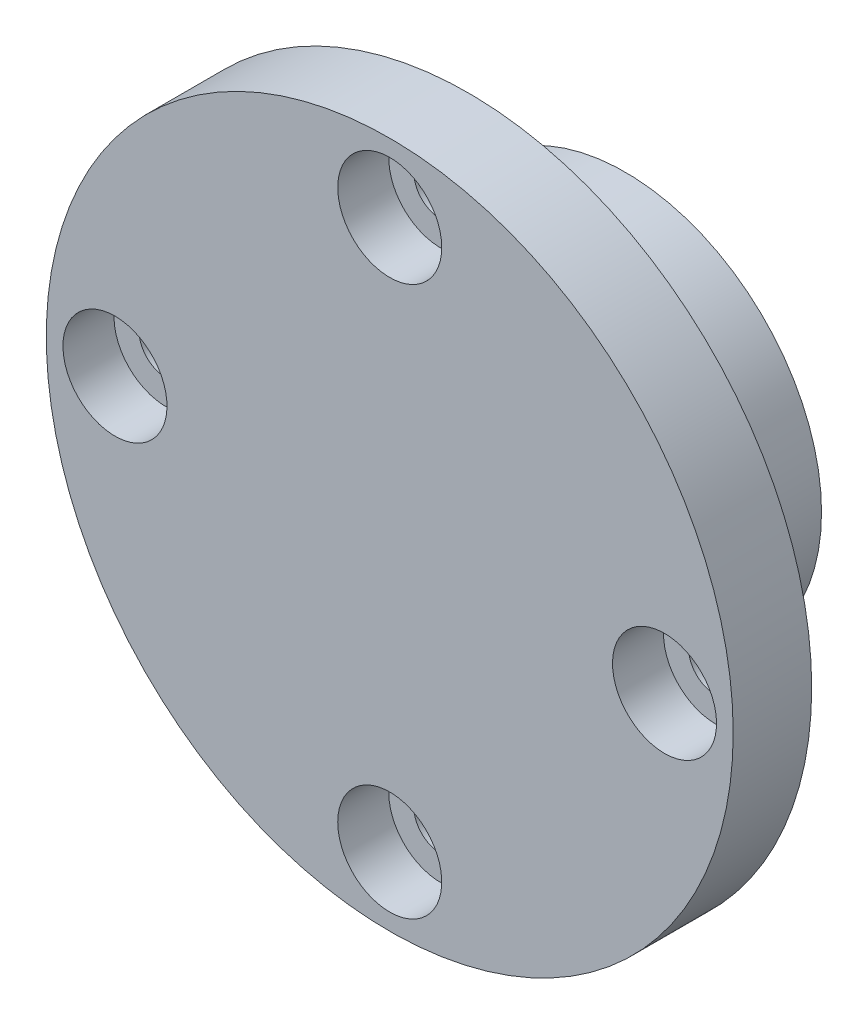
ISO-10303-21;
HEADER;
FILE_DESCRIPTION(('STEP AP214'),'2;1');
FILE_NAME('part.step','',(''),(''),'','','');
FILE_SCHEMA(('AUTOMOTIVE_DESIGN { 1 0 10303 214 1 1 1 1 }'));
ENDSEC;
DATA;
#1=APPLICATION_CONTEXT('core data for automotive mechanical design processes');
#2=APPLICATION_PROTOCOL_DEFINITION('international standard','automotive_design',2000,#1);
#3=PRODUCT_CONTEXT('',#1,'mechanical');
#4=PRODUCT('Part','Part','',(#3));
#5=PRODUCT_RELATED_PRODUCT_CATEGORY('part','',(#4));
#6=PRODUCT_DEFINITION_FORMATION('','',#4);
#7=PRODUCT_DEFINITION_CONTEXT('part definition',#1,'design');
#8=PRODUCT_DEFINITION('design','',#6,#7);
#9=PRODUCT_DEFINITION_SHAPE('','',#8);
#10=(LENGTH_UNIT() NAMED_UNIT(*) SI_UNIT(.MILLI.,.METRE.));
#11=(NAMED_UNIT(*) PLANE_ANGLE_UNIT() SI_UNIT($,.RADIAN.));
#12=(NAMED_UNIT(*) SI_UNIT($,.STERADIAN.) SOLID_ANGLE_UNIT());
#13=UNCERTAINTY_MEASURE_WITH_UNIT(LENGTH_MEASURE(1.E-05),#10,'distance_accuracy_value','');
#14=(GEOMETRIC_REPRESENTATION_CONTEXT(3) GLOBAL_UNCERTAINTY_ASSIGNED_CONTEXT((#13)) GLOBAL_UNIT_ASSIGNED_CONTEXT((#10,
#11,#12)) REPRESENTATION_CONTEXT('',''));
#15=CARTESIAN_POINT('',(0.,0.,0.));
#16=DIRECTION('',(0.,0.,1.));
#17=DIRECTION('',(1.,0.,0.));
#18=AXIS2_PLACEMENT_3D('',#15,#16,#17);
#19=CARTESIAN_POINT('',(14.,1.46642216231412E-13,12.001));
#20=DIRECTION('',(0.,0.,-1.));
#21=DIRECTION('',(-1.,0.,0.));
#22=AXIS2_PLACEMENT_3D('',#19,#20,#21);
#23=CYLINDRICAL_SURFACE('',#22,1.375);
#24=CARTESIAN_POINT('',(14.,1.46642216231412E-13,8.));
#25=DIRECTION('',(0.,0.,-1.));
#26=DIRECTION('',(0.,1.,0.));
#27=AXIS2_PLACEMENT_3D('',#24,#25,#26);
#28=CIRCLE('',#27,1.375);
#29=CARTESIAN_POINT('',(14.,1.37500000000015,8.));
#30=VERTEX_POINT('',#29);
#31=EDGE_CURVE('E146',#30,#30,#28,.T.);
#32=ORIENTED_EDGE('',*,*,#31,.T.);
#33=EDGE_LOOP('',(#32));
#34=FACE_BOUND('',#33,.T.);
#35=CARTESIAN_POINT('',(14.,1.46642216231412E-13,9.4));
#36=DIRECTION('',(0.,0.,1.));
#37=DIRECTION('',(1.,0.,0.));
#38=AXIS2_PLACEMENT_3D('',#35,#36,#37);
#39=CIRCLE('',#38,1.375);
#40=CARTESIAN_POINT('',(15.375,1.46642216231412E-13,9.4));
#41=VERTEX_POINT('',#40);
#42=EDGE_CURVE('E43',#41,#41,#39,.F.);
#43=ORIENTED_EDGE('',*,*,#42,.F.);
#44=EDGE_LOOP('',(#43));
#45=FACE_BOUND('',#44,.T.);
#46=ADVANCED_FACE('F39',(#34,#45),#23,.F.);
#47=CARTESIAN_POINT('',(0.,-14.,12.001));
#48=DIRECTION('',(0.,0.,-1.));
#49=DIRECTION('',(-1.,0.,0.));
#50=AXIS2_PLACEMENT_3D('',#47,#48,#49);
#51=CYLINDRICAL_SURFACE('',#50,1.375);
#52=CARTESIAN_POINT('',(0.,-14.,8.));
#53=DIRECTION('',(0.,0.,-1.));
#54=DIRECTION('',(1.,0.,0.));
#55=AXIS2_PLACEMENT_3D('',#52,#53,#54);
#56=CIRCLE('',#55,1.375);
#57=CARTESIAN_POINT('',(1.375,-14.,8.));
#58=VERTEX_POINT('',#57);
#59=EDGE_CURVE('E177',#58,#58,#56,.T.);
#60=ORIENTED_EDGE('',*,*,#59,.T.);
#61=EDGE_LOOP('',(#60));
#62=FACE_BOUND('',#61,.T.);
#63=CARTESIAN_POINT('',(0.,-14.,9.4));
#64=DIRECTION('',(0.,0.,1.));
#65=DIRECTION('',(1.,0.,0.));
#66=AXIS2_PLACEMENT_3D('',#63,#64,#65);
#67=CIRCLE('',#66,1.375);
#68=CARTESIAN_POINT('',(1.375,-14.,9.4));
#69=VERTEX_POINT('',#68);
#70=EDGE_CURVE('E151',#69,#69,#67,.F.);
#71=ORIENTED_EDGE('',*,*,#70,.F.);
#72=EDGE_LOOP('',(#71));
#73=FACE_BOUND('',#72,.T.);
#74=ADVANCED_FACE('F243',(#62,#73),#51,.F.);
#75=CARTESIAN_POINT('',(-14.,0.,12.001));
#76=DIRECTION('',(0.,0.,-1.));
#77=DIRECTION('',(-1.,0.,0.));
#78=AXIS2_PLACEMENT_3D('',#75,#76,#77);
#79=CYLINDRICAL_SURFACE('',#78,1.375);
#80=CARTESIAN_POINT('',(-14.,0.,8.));
#81=DIRECTION('',(0.,0.,-1.));
#82=DIRECTION('',(0.,-1.,0.));
#83=AXIS2_PLACEMENT_3D('',#80,#81,#82);
#84=CIRCLE('',#83,1.375);
#85=CARTESIAN_POINT('',(-14.,-1.37500000000005,8.));
#86=VERTEX_POINT('',#85);
#87=EDGE_CURVE('E172',#86,#86,#84,.T.);
#88=ORIENTED_EDGE('',*,*,#87,.T.);
#89=EDGE_LOOP('',(#88));
#90=FACE_BOUND('',#89,.T.);
#91=CARTESIAN_POINT('',(-14.,0.,9.4));
#92=DIRECTION('',(0.,0.,1.));
#93=DIRECTION('',(1.,0.,0.));
#94=AXIS2_PLACEMENT_3D('',#91,#92,#93);
#95=CIRCLE('',#94,1.375);
#96=CARTESIAN_POINT('',(-12.625,0.,9.4));
#97=VERTEX_POINT('',#96);
#98=EDGE_CURVE('E148',#97,#97,#95,.F.);
#99=ORIENTED_EDGE('',*,*,#98,.F.);
#100=EDGE_LOOP('',(#99));
#101=FACE_BOUND('',#100,.T.);
#102=ADVANCED_FACE('F249',(#90,#101),#79,.F.);
#103=CARTESIAN_POINT('',(0.,14.,12.001));
#104=DIRECTION('',(0.,0.,-1.));
#105=DIRECTION('',(-1.,0.,0.));
#106=AXIS2_PLACEMENT_3D('',#103,#104,#105);
#107=CYLINDRICAL_SURFACE('',#106,1.375);
#108=CARTESIAN_POINT('',(0.,14.,8.));
#109=DIRECTION('',(0.,0.,-1.));
#110=DIRECTION('',(-1.,0.,0.));
#111=AXIS2_PLACEMENT_3D('',#108,#109,#110);
#112=CIRCLE('',#111,1.375);
#113=CARTESIAN_POINT('',(-1.375,14.,8.));
#114=VERTEX_POINT('',#113);
#115=EDGE_CURVE('E176',#114,#114,#112,.T.);
#116=ORIENTED_EDGE('',*,*,#115,.T.);
#117=EDGE_LOOP('',(#116));
#118=FACE_BOUND('',#117,.T.);
#119=CARTESIAN_POINT('',(0.,14.,9.4));
#120=DIRECTION('',(0.,0.,1.));
#121=DIRECTION('',(1.,0.,0.));
#122=AXIS2_PLACEMENT_3D('',#119,#120,#121);
#123=CIRCLE('',#122,1.375);
#124=CARTESIAN_POINT('',(1.375,14.,9.4));
#125=VERTEX_POINT('',#124);
#126=EDGE_CURVE('E142',#125,#125,#123,.F.);
#127=ORIENTED_EDGE('',*,*,#126,.F.);
#128=EDGE_LOOP('',(#127));
#129=FACE_BOUND('',#128,.T.);
#130=ADVANCED_FACE('F255',(#118,#129),#107,.F.);
#131=CARTESIAN_POINT('',(0.,0.,0.));
#132=DIRECTION('',(0.,0.,1.));
#133=DIRECTION('',(1.,0.,0.));
#134=AXIS2_PLACEMENT_3D('',#131,#132,#133);
#135=PLANE('',#134);
#136=CARTESIAN_POINT('',(0.,0.,0.));
#137=DIRECTION('',(0.,0.,1.));
#138=DIRECTION('',(1.,0.,0.));
#139=AXIS2_PLACEMENT_3D('',#136,#137,#138);
#140=CIRCLE('',#139,10.);
#141=CARTESIAN_POINT('',(10.,0.,0.));
#142=VERTEX_POINT('',#141);
#143=EDGE_CURVE('E49',#142,#142,#140,.T.);
#144=ORIENTED_EDGE('',*,*,#143,.F.);
#145=EDGE_LOOP('',(#144));
#146=FACE_BOUND('',#145,.T.);
#147=DIRECTION('',(0.499999999999995,0.866025403784441,0.));
#148=VECTOR('',#147,1.);
#149=CARTESIAN_POINT('',(3.6661742093542,-6.34999999999996,0.));
#150=LINE('',#149,#148);
#151=CARTESIAN_POINT('',(3.6661742093542,-6.34999999999996,0.));
#152=VERTEX_POINT('',#151);
#153=CARTESIAN_POINT('',(7.33234841870825,0.,0.));
#154=VERTEX_POINT('',#153);
#155=EDGE_CURVE('E57',#152,#154,#150,.T.);
#156=ORIENTED_EDGE('',*,*,#155,.T.);
#157=DIRECTION('',(-0.500000000000001,0.866025403784438,0.));
#158=VECTOR('',#157,1.);
#159=CARTESIAN_POINT('',(7.33234841870825,0.,0.));
#160=LINE('',#159,#158);
#161=CARTESIAN_POINT('',(3.66617420935411,6.35000000000001,0.));
#162=VERTEX_POINT('',#161);
#163=EDGE_CURVE('E118',#154,#162,#160,.T.);
#164=ORIENTED_EDGE('',*,*,#163,.T.);
#165=DIRECTION('',(-1.,0.,0.));
#166=VECTOR('',#165,1.);
#167=CARTESIAN_POINT('',(3.66617420935411,6.35000000000001,0.));
#168=LINE('',#167,#166);
#169=CARTESIAN_POINT('',(-3.66617420935416,6.34999999999999,0.));
#170=VERTEX_POINT('',#169);
#171=EDGE_CURVE('E114',#162,#170,#168,.T.);
#172=ORIENTED_EDGE('',*,*,#171,.T.);
#173=DIRECTION('',(-0.499999999999995,-0.866025403784442,0.));
#174=VECTOR('',#173,1.);
#175=CARTESIAN_POINT('',(-3.66617420935416,6.34999999999999,0.));
#176=LINE('',#175,#174);
#177=CARTESIAN_POINT('',(-7.33234841870825,0.,0.));
#178=VERTEX_POINT('',#177);
#179=EDGE_CURVE('E92',#170,#178,#176,.T.);
#180=ORIENTED_EDGE('',*,*,#179,.T.);
#181=DIRECTION('',(0.500000000000007,-0.866025403784434,0.));
#182=VECTOR('',#181,1.);
#183=CARTESIAN_POINT('',(-7.33234841870825,0.,0.));
#184=LINE('',#183,#182);
#185=CARTESIAN_POINT('',(-3.66617420935407,-6.35000000000004,0.));
#186=VERTEX_POINT('',#185);
#187=EDGE_CURVE('E102',#178,#186,#184,.T.);
#188=ORIENTED_EDGE('',*,*,#187,.T.);
#189=DIRECTION('',(1.,0.,0.));
#190=VECTOR('',#189,1.);
#191=CARTESIAN_POINT('',(-3.66617420935407,-6.35000000000004,0.));
#192=LINE('',#191,#190);
#193=EDGE_CURVE('E109',#186,#152,#192,.T.);
#194=ORIENTED_EDGE('',*,*,#193,.T.);
#195=EDGE_LOOP('',(#156,#164,#172,#180,#188,#194));
#196=FACE_BOUND('',#195,.T.);
#197=ADVANCED_FACE('F111',(#146,#196),#135,.F.);
#198=CARTESIAN_POINT('',(0.,0.,8.));
#199=DIRECTION('',(0.,0.,-1.));
#200=DIRECTION('',(-1.,0.,0.));
#201=AXIS2_PLACEMENT_3D('',#198,#199,#200);
#202=CYLINDRICAL_SURFACE('',#201,10.);
#203=CARTESIAN_POINT('',(0.,0.,8.));
#204=DIRECTION('',(0.,0.,1.));
#205=DIRECTION('',(1.,0.,0.));
#206=AXIS2_PLACEMENT_3D('',#203,#204,#205);
#207=CIRCLE('',#206,10.);
#208=CARTESIAN_POINT('',(10.,0.,8.));
#209=VERTEX_POINT('',#208);
#210=EDGE_CURVE('E11',#209,#209,#207,.T.);
#211=ORIENTED_EDGE('',*,*,#210,.F.);
#212=EDGE_LOOP('',(#211));
#213=FACE_BOUND('',#212,.T.);
#214=ORIENTED_EDGE('',*,*,#143,.T.);
#215=EDGE_LOOP('',(#214));
#216=FACE_BOUND('',#215,.T.);
#217=ADVANCED_FACE('F41',(#213,#216),#202,.T.);
#218=CARTESIAN_POINT('',(3.6661742093542,-6.34999999999996,8.));
#219=DIRECTION('',(-0.866025403784441,0.499999999999995,0.));
#220=DIRECTION('',(-0.499999999999995,-0.866025403784442,0.));
#221=AXIS2_PLACEMENT_3D('',#218,#219,#220);
#222=PLANE('',#221);
#223=ORIENTED_EDGE('',*,*,#155,.F.);
#224=DIRECTION('',(0.,0.,-1.));
#225=VECTOR('',#224,1.);
#226=CARTESIAN_POINT('',(3.6661742093542,-6.34999999999996,8.));
#227=LINE('',#226,#225);
#228=CARTESIAN_POINT('',(3.6661742093542,-6.34999999999996,8.));
#229=VERTEX_POINT('',#228);
#230=EDGE_CURVE('E125',#229,#152,#227,.T.);
#231=ORIENTED_EDGE('',*,*,#230,.F.);
#232=DIRECTION('',(0.499999999999995,0.866025403784441,0.));
#233=VECTOR('',#232,1.);
#234=CARTESIAN_POINT('',(3.6661742093542,-6.34999999999996,8.));
#235=LINE('',#234,#233);
#236=CARTESIAN_POINT('',(7.33234841870825,0.,8.));
#237=VERTEX_POINT('',#236);
#238=EDGE_CURVE('E124',#229,#237,#235,.T.);
#239=ORIENTED_EDGE('',*,*,#238,.T.);
#240=DIRECTION('',(0.,0.,-1.));
#241=VECTOR('',#240,1.);
#242=CARTESIAN_POINT('',(7.33234841870825,0.,8.));
#243=LINE('',#242,#241);
#244=EDGE_CURVE('E136',#237,#154,#243,.T.);
#245=ORIENTED_EDGE('',*,*,#244,.T.);
#246=EDGE_LOOP('',(#223,#231,#239,#245));
#247=FACE_BOUND('',#246,.T.);
#248=ADVANCED_FACE('F219',(#247),#222,.T.);
#249=CARTESIAN_POINT('',(7.33234841870825,0.,8.));
#250=DIRECTION('',(-0.866025403784438,-0.500000000000001,0.));
#251=DIRECTION('',(0.500000000000001,-0.866025403784438,0.));
#252=AXIS2_PLACEMENT_3D('',#249,#250,#251);
#253=PLANE('',#252);
#254=ORIENTED_EDGE('',*,*,#163,.F.);
#255=ORIENTED_EDGE('',*,*,#244,.F.);
#256=DIRECTION('',(-0.500000000000001,0.866025403784438,0.));
#257=VECTOR('',#256,1.);
#258=CARTESIAN_POINT('',(7.33234841870825,0.,8.));
#259=LINE('',#258,#257);
#260=CARTESIAN_POINT('',(3.66617420935411,6.35000000000001,8.));
#261=VERTEX_POINT('',#260);
#262=EDGE_CURVE('E198',#237,#261,#259,.T.);
#263=ORIENTED_EDGE('',*,*,#262,.T.);
#264=DIRECTION('',(0.,0.,-1.));
#265=VECTOR('',#264,1.);
#266=CARTESIAN_POINT('',(3.66617420935411,6.35000000000001,8.));
#267=LINE('',#266,#265);
#268=EDGE_CURVE('E133',#261,#162,#267,.T.);
#269=ORIENTED_EDGE('',*,*,#268,.T.);
#270=EDGE_LOOP('',(#254,#255,#263,#269));
#271=FACE_BOUND('',#270,.T.);
#272=ADVANCED_FACE('F217',(#271),#253,.T.);
#273=CARTESIAN_POINT('',(3.66617420935411,6.35000000000001,8.));
#274=DIRECTION('',(0.,-1.,0.));
#275=DIRECTION('',(1.,0.,0.));
#276=AXIS2_PLACEMENT_3D('',#273,#274,#275);
#277=PLANE('',#276);
#278=ORIENTED_EDGE('',*,*,#171,.F.);
#279=ORIENTED_EDGE('',*,*,#268,.F.);
#280=DIRECTION('',(-1.,0.,0.));
#281=VECTOR('',#280,1.);
#282=CARTESIAN_POINT('',(3.66617420935411,6.35000000000001,8.));
#283=LINE('',#282,#281);
#284=CARTESIAN_POINT('',(-3.66617420935416,6.34999999999999,8.));
#285=VERTEX_POINT('',#284);
#286=EDGE_CURVE('E202',#261,#285,#283,.T.);
#287=ORIENTED_EDGE('',*,*,#286,.T.);
#288=DIRECTION('',(0.,0.,-1.));
#289=VECTOR('',#288,1.);
#290=CARTESIAN_POINT('',(-3.66617420935416,6.34999999999999,8.));
#291=LINE('',#290,#289);
#292=EDGE_CURVE('E98',#285,#170,#291,.T.);
#293=ORIENTED_EDGE('',*,*,#292,.T.);
#294=EDGE_LOOP('',(#278,#279,#287,#293));
#295=FACE_BOUND('',#294,.T.);
#296=ADVANCED_FACE('F233',(#295),#277,.T.);
#297=CARTESIAN_POINT('',(-3.66617420935416,6.34999999999999,8.));
#298=DIRECTION('',(0.866025403784442,-0.499999999999995,0.));
#299=DIRECTION('',(0.499999999999995,0.866025403784442,0.));
#300=AXIS2_PLACEMENT_3D('',#297,#298,#299);
#301=PLANE('',#300);
#302=ORIENTED_EDGE('',*,*,#179,.F.);
#303=ORIENTED_EDGE('',*,*,#292,.F.);
#304=DIRECTION('',(-0.499999999999995,-0.866025403784442,0.));
#305=VECTOR('',#304,1.);
#306=CARTESIAN_POINT('',(-3.66617420935416,6.34999999999999,8.));
#307=LINE('',#306,#305);
#308=CARTESIAN_POINT('',(-7.33234841870825,0.,8.));
#309=VERTEX_POINT('',#308);
#310=EDGE_CURVE('E66',#285,#309,#307,.T.);
#311=ORIENTED_EDGE('',*,*,#310,.T.);
#312=DIRECTION('',(0.,0.,-1.));
#313=VECTOR('',#312,1.);
#314=CARTESIAN_POINT('',(-7.33234841870825,0.,8.));
#315=LINE('',#314,#313);
#316=EDGE_CURVE('E87',#309,#178,#315,.T.);
#317=ORIENTED_EDGE('',*,*,#316,.T.);
#318=EDGE_LOOP('',(#302,#303,#311,#317));
#319=FACE_BOUND('',#318,.T.);
#320=ADVANCED_FACE('F89',(#319),#301,.T.);
#321=CARTESIAN_POINT('',(-7.33234841870825,0.,8.));
#322=DIRECTION('',(0.866025403784435,0.500000000000007,0.));
#323=DIRECTION('',(-0.500000000000007,0.866025403784435,0.));
#324=AXIS2_PLACEMENT_3D('',#321,#322,#323);
#325=PLANE('',#324);
#326=ORIENTED_EDGE('',*,*,#187,.F.);
#327=ORIENTED_EDGE('',*,*,#316,.F.);
#328=DIRECTION('',(0.500000000000007,-0.866025403784434,0.));
#329=VECTOR('',#328,1.);
#330=CARTESIAN_POINT('',(-7.33234841870825,0.,8.));
#331=LINE('',#330,#329);
#332=CARTESIAN_POINT('',(-3.66617420935407,-6.35000000000004,8.));
#333=VERTEX_POINT('',#332);
#334=EDGE_CURVE('E207',#309,#333,#331,.T.);
#335=ORIENTED_EDGE('',*,*,#334,.T.);
#336=DIRECTION('',(0.,0.,-1.));
#337=VECTOR('',#336,1.);
#338=CARTESIAN_POINT('',(-3.66617420935407,-6.35000000000004,8.));
#339=LINE('',#338,#337);
#340=EDGE_CURVE('E99',#333,#186,#339,.T.);
#341=ORIENTED_EDGE('',*,*,#340,.T.);
#342=EDGE_LOOP('',(#326,#327,#335,#341));
#343=FACE_BOUND('',#342,.T.);
#344=ADVANCED_FACE('F103',(#343),#325,.T.);
#345=CARTESIAN_POINT('',(-3.66617420935407,-6.35000000000004,8.));
#346=DIRECTION('',(0.,1.,0.));
#347=DIRECTION('',(-1.,0.,0.));
#348=AXIS2_PLACEMENT_3D('',#345,#346,#347);
#349=PLANE('',#348);
#350=ORIENTED_EDGE('',*,*,#193,.F.);
#351=ORIENTED_EDGE('',*,*,#340,.F.);
#352=DIRECTION('',(1.,0.,0.));
#353=VECTOR('',#352,1.);
#354=CARTESIAN_POINT('',(-3.66617420935407,-6.35000000000004,8.));
#355=LINE('',#354,#353);
#356=EDGE_CURVE('E128',#333,#229,#355,.T.);
#357=ORIENTED_EDGE('',*,*,#356,.T.);
#358=ORIENTED_EDGE('',*,*,#230,.T.);
#359=EDGE_LOOP('',(#350,#351,#357,#358));
#360=FACE_BOUND('',#359,.T.);
#361=ADVANCED_FACE('F227',(#360),#349,.T.);
#362=CARTESIAN_POINT('',(0.,0.,8.));
#363=DIRECTION('',(0.,0.,1.));
#364=DIRECTION('',(1.,0.,0.));
#365=AXIS2_PLACEMENT_3D('',#362,#363,#364);
#366=PLANE('',#365);
#367=ORIENTED_EDGE('',*,*,#262,.F.);
#368=ORIENTED_EDGE('',*,*,#238,.F.);
#369=ORIENTED_EDGE('',*,*,#356,.F.);
#370=ORIENTED_EDGE('',*,*,#334,.F.);
#371=ORIENTED_EDGE('',*,*,#310,.F.);
#372=ORIENTED_EDGE('',*,*,#286,.F.);
#373=EDGE_LOOP('',(#367,#368,#369,#370,#371,#372));
#374=FACE_BOUND('',#373,.T.);
#375=ADVANCED_FACE('F224',(#374),#366,.F.);
#376=ORIENTED_EDGE('',*,*,#87,.F.);
#377=EDGE_LOOP('',(#376));
#378=FACE_BOUND('',#377,.T.);
#379=ORIENTED_EDGE('',*,*,#59,.F.);
#380=EDGE_LOOP('',(#379));
#381=FACE_BOUND('',#380,.T.);
#382=ORIENTED_EDGE('',*,*,#31,.F.);
#383=EDGE_LOOP('',(#382));
#384=FACE_BOUND('',#383,.T.);
#385=ORIENTED_EDGE('',*,*,#115,.F.);
#386=EDGE_LOOP('',(#385));
#387=FACE_BOUND('',#386,.T.);
#388=CARTESIAN_POINT('',(0.,0.,8.));
#389=DIRECTION('',(0.,0.,1.));
#390=DIRECTION('',(1.,0.,0.));
#391=AXIS2_PLACEMENT_3D('',#388,#389,#390);
#392=CIRCLE('',#391,17.5);
#393=CARTESIAN_POINT('',(17.5,0.,8.));
#394=VERTEX_POINT('',#393);
#395=EDGE_CURVE('E187',#394,#394,#392,.T.);
#396=ORIENTED_EDGE('',*,*,#395,.F.);
#397=EDGE_LOOP('',(#396));
#398=FACE_BOUND('',#397,.T.);
#399=ORIENTED_EDGE('',*,*,#210,.T.);
#400=EDGE_LOOP('',(#399));
#401=FACE_BOUND('',#400,.T.);
#402=ADVANCED_FACE('F267',(#378,#381,#384,#387,#398,#401),#366,.F.);
#403=CARTESIAN_POINT('',(0.,0.,12.));
#404=DIRECTION('',(0.,0.,-1.));
#405=DIRECTION('',(-1.,0.,0.));
#406=AXIS2_PLACEMENT_3D('',#403,#404,#405);
#407=CYLINDRICAL_SURFACE('',#406,17.5);
#408=CARTESIAN_POINT('',(0.,0.,12.));
#409=DIRECTION('',(0.,0.,1.));
#410=DIRECTION('',(1.,0.,0.));
#411=AXIS2_PLACEMENT_3D('',#408,#409,#410);
#412=CIRCLE('',#411,17.5);
#413=CARTESIAN_POINT('',(17.5,0.,12.));
#414=VERTEX_POINT('',#413);
#415=EDGE_CURVE('E188',#414,#414,#412,.T.);
#416=ORIENTED_EDGE('',*,*,#415,.F.);
#417=EDGE_LOOP('',(#416));
#418=FACE_BOUND('',#417,.T.);
#419=ORIENTED_EDGE('',*,*,#395,.T.);
#420=EDGE_LOOP('',(#419));
#421=FACE_BOUND('',#420,.T.);
#422=ADVANCED_FACE('F263',(#418,#421),#407,.T.);
#423=CARTESIAN_POINT('',(0.,0.,12.));
#424=DIRECTION('',(0.,0.,1.));
#425=DIRECTION('',(1.,0.,0.));
#426=AXIS2_PLACEMENT_3D('',#423,#424,#425);
#427=PLANE('',#426);
#428=CARTESIAN_POINT('',(14.,0.,12.));
#429=DIRECTION('',(0.,0.,1.));
#430=DIRECTION('',(0.,-1.,0.));
#431=AXIS2_PLACEMENT_3D('',#428,#429,#430);
#432=CIRCLE('',#431,2.65);
#433=CARTESIAN_POINT('',(14.,-2.65000000000005,12.));
#434=VERTEX_POINT('',#433);
#435=EDGE_CURVE('E481',#434,#434,#432,.T.);
#436=ORIENTED_EDGE('',*,*,#435,.F.);
#437=EDGE_LOOP('',(#436));
#438=FACE_BOUND('',#437,.T.);
#439=CARTESIAN_POINT('',(0.,-14.,12.));
#440=DIRECTION('',(0.,0.,1.));
#441=DIRECTION('',(-1.,0.,0.));
#442=AXIS2_PLACEMENT_3D('',#439,#440,#441);
#443=CIRCLE('',#442,2.65);
#444=CARTESIAN_POINT('',(-2.65,-14.,12.));
#445=VERTEX_POINT('',#444);
#446=EDGE_CURVE('E489',#445,#445,#443,.T.);
#447=ORIENTED_EDGE('',*,*,#446,.F.);
#448=EDGE_LOOP('',(#447));
#449=FACE_BOUND('',#448,.T.);
#450=CARTESIAN_POINT('',(-14.,1.46642216231412E-13,12.));
#451=DIRECTION('',(0.,0.,1.));
#452=DIRECTION('',(0.,1.,0.));
#453=AXIS2_PLACEMENT_3D('',#450,#451,#452);
#454=CIRCLE('',#453,2.65);
#455=CARTESIAN_POINT('',(-14.,2.65000000000015,12.));
#456=VERTEX_POINT('',#455);
#457=EDGE_CURVE('E498',#456,#456,#454,.T.);
#458=ORIENTED_EDGE('',*,*,#457,.F.);
#459=EDGE_LOOP('',(#458));
#460=FACE_BOUND('',#459,.T.);
#461=CARTESIAN_POINT('',(0.,14.,12.));
#462=DIRECTION('',(0.,0.,1.));
#463=DIRECTION('',(1.,0.,0.));
#464=AXIS2_PLACEMENT_3D('',#461,#462,#463);
#465=CIRCLE('',#464,2.65);
#466=CARTESIAN_POINT('',(2.65,14.,12.));
#467=VERTEX_POINT('',#466);
#468=EDGE_CURVE('E159',#467,#467,#465,.T.);
#469=ORIENTED_EDGE('',*,*,#468,.F.);
#470=EDGE_LOOP('',(#469));
#471=FACE_BOUND('',#470,.T.);
#472=ORIENTED_EDGE('',*,*,#415,.T.);
#473=EDGE_LOOP('',(#472));
#474=FACE_BOUND('',#473,.T.);
#475=ADVANCED_FACE('F259',(#438,#449,#460,#471,#474),#427,.T.);
#476=CARTESIAN_POINT('',(0.,14.,9.4));
#477=DIRECTION('',(0.,0.,1.));
#478=DIRECTION('',(1.,0.,0.));
#479=AXIS2_PLACEMENT_3D('',#476,#477,#478);
#480=PLANE('',#479);
#481=CARTESIAN_POINT('',(0.,14.,9.4));
#482=DIRECTION('',(0.,0.,1.));
#483=DIRECTION('',(1.,0.,0.));
#484=AXIS2_PLACEMENT_3D('',#481,#482,#483);
#485=CIRCLE('',#484,2.65);
#486=CARTESIAN_POINT('',(2.65,14.,9.4));
#487=VERTEX_POINT('',#486);
#488=EDGE_CURVE('E147',#487,#487,#485,.T.);
#489=ORIENTED_EDGE('',*,*,#488,.T.);
#490=EDGE_LOOP('',(#489));
#491=FACE_BOUND('',#490,.T.);
#492=ORIENTED_EDGE('',*,*,#126,.T.);
#493=EDGE_LOOP('',(#492));
#494=FACE_BOUND('',#493,.T.);
#495=ADVANCED_FACE('F262',(#491,#494),#480,.T.);
#496=CARTESIAN_POINT('',(0.,14.,9.4));
#497=DIRECTION('',(0.,0.,1.));
#498=DIRECTION('',(1.,0.,0.));
#499=AXIS2_PLACEMENT_3D('',#496,#497,#498);
#500=CYLINDRICAL_SURFACE('',#499,2.65);
#501=ORIENTED_EDGE('',*,*,#488,.F.);
#502=EDGE_LOOP('',(#501));
#503=FACE_BOUND('',#502,.T.);
#504=ORIENTED_EDGE('',*,*,#468,.T.);
#505=EDGE_LOOP('',(#504));
#506=FACE_BOUND('',#505,.T.);
#507=ADVANCED_FACE('F309',(#503,#506),#500,.F.);
#508=CARTESIAN_POINT('',(-14.,1.46642216231412E-13,9.4));
#509=DIRECTION('',(0.,0.,1.));
#510=DIRECTION('',(0.,1.,0.));
#511=AXIS2_PLACEMENT_3D('',#508,#509,#510);
#512=PLANE('',#511);
#513=CARTESIAN_POINT('',(-14.,1.46642216231412E-13,9.4));
#514=DIRECTION('',(0.,0.,1.));
#515=DIRECTION('',(0.,1.,0.));
#516=AXIS2_PLACEMENT_3D('',#513,#514,#515);
#517=CIRCLE('',#516,2.65);
#518=CARTESIAN_POINT('',(-14.,2.65000000000015,9.4));
#519=VERTEX_POINT('',#518);
#520=EDGE_CURVE('E495',#519,#519,#517,.T.);
#521=ORIENTED_EDGE('',*,*,#520,.T.);
#522=EDGE_LOOP('',(#521));
#523=FACE_BOUND('',#522,.T.);
#524=ORIENTED_EDGE('',*,*,#98,.T.);
#525=EDGE_LOOP('',(#524));
#526=FACE_BOUND('',#525,.T.);
#527=ADVANCED_FACE('F317',(#523,#526),#512,.T.);
#528=CARTESIAN_POINT('',(-14.,1.46642216231412E-13,9.4));
#529=DIRECTION('',(0.,0.,1.));
#530=DIRECTION('',(1.,0.,0.));
#531=AXIS2_PLACEMENT_3D('',#528,#529,#530);
#532=CYLINDRICAL_SURFACE('',#531,2.65);
#533=ORIENTED_EDGE('',*,*,#520,.F.);
#534=EDGE_LOOP('',(#533));
#535=FACE_BOUND('',#534,.T.);
#536=ORIENTED_EDGE('',*,*,#457,.T.);
#537=EDGE_LOOP('',(#536));
#538=FACE_BOUND('',#537,.T.);
#539=ADVANCED_FACE('F324',(#535,#538),#532,.F.);
#540=CARTESIAN_POINT('',(0.,-14.,9.4));
#541=DIRECTION('',(0.,0.,1.));
#542=DIRECTION('',(-1.,0.,0.));
#543=AXIS2_PLACEMENT_3D('',#540,#541,#542);
#544=PLANE('',#543);
#545=CARTESIAN_POINT('',(0.,-14.,9.4));
#546=DIRECTION('',(0.,0.,1.));
#547=DIRECTION('',(-1.,0.,0.));
#548=AXIS2_PLACEMENT_3D('',#545,#546,#547);
#549=CIRCLE('',#548,2.65);
#550=CARTESIAN_POINT('',(-2.65,-14.,9.4));
#551=VERTEX_POINT('',#550);
#552=EDGE_CURVE('E483',#551,#551,#549,.T.);
#553=ORIENTED_EDGE('',*,*,#552,.T.);
#554=EDGE_LOOP('',(#553));
#555=FACE_BOUND('',#554,.T.);
#556=ORIENTED_EDGE('',*,*,#70,.T.);
#557=EDGE_LOOP('',(#556));
#558=FACE_BOUND('',#557,.T.);
#559=ADVANCED_FACE('F332',(#555,#558),#544,.T.);
#560=CARTESIAN_POINT('',(0.,-14.,9.4));
#561=DIRECTION('',(0.,0.,1.));
#562=DIRECTION('',(1.,0.,0.));
#563=AXIS2_PLACEMENT_3D('',#560,#561,#562);
#564=CYLINDRICAL_SURFACE('',#563,2.65);
#565=ORIENTED_EDGE('',*,*,#552,.F.);
#566=EDGE_LOOP('',(#565));
#567=FACE_BOUND('',#566,.T.);
#568=ORIENTED_EDGE('',*,*,#446,.T.);
#569=EDGE_LOOP('',(#568));
#570=FACE_BOUND('',#569,.T.);
#571=ADVANCED_FACE('F340',(#567,#570),#564,.F.);
#572=CARTESIAN_POINT('',(14.,0.,9.4));
#573=DIRECTION('',(0.,0.,1.));
#574=DIRECTION('',(0.,-1.,0.));
#575=AXIS2_PLACEMENT_3D('',#572,#573,#574);
#576=PLANE('',#575);
#577=CARTESIAN_POINT('',(14.,0.,9.4));
#578=DIRECTION('',(0.,0.,1.));
#579=DIRECTION('',(0.,-1.,0.));
#580=AXIS2_PLACEMENT_3D('',#577,#578,#579);
#581=CIRCLE('',#580,2.65);
#582=CARTESIAN_POINT('',(14.,-2.65000000000005,9.4));
#583=VERTEX_POINT('',#582);
#584=EDGE_CURVE('E152',#583,#583,#581,.T.);
#585=ORIENTED_EDGE('',*,*,#584,.T.);
#586=EDGE_LOOP('',(#585));
#587=FACE_BOUND('',#586,.T.);
#588=ORIENTED_EDGE('',*,*,#42,.T.);
#589=EDGE_LOOP('',(#588));
#590=FACE_BOUND('',#589,.T.);
#591=ADVANCED_FACE('F348',(#587,#590),#576,.T.);
#592=CARTESIAN_POINT('',(14.,0.,9.4));
#593=DIRECTION('',(0.,0.,1.));
#594=DIRECTION('',(1.,0.,0.));
#595=AXIS2_PLACEMENT_3D('',#592,#593,#594);
#596=CYLINDRICAL_SURFACE('',#595,2.65);
#597=ORIENTED_EDGE('',*,*,#584,.F.);
#598=EDGE_LOOP('',(#597));
#599=FACE_BOUND('',#598,.T.);
#600=ORIENTED_EDGE('',*,*,#435,.T.);
#601=EDGE_LOOP('',(#600));
#602=FACE_BOUND('',#601,.T.);
#603=ADVANCED_FACE('F356',(#599,#602),#596,.F.);
#604=CLOSED_SHELL('',(#46,#74,#102,#130,#197,#217,#248,#272,#296,#320,#344,#361,#375,#402,#422,
#475,#495,#507,#527,#539,#559,#571,#591,#603));
#605=MANIFOLD_SOLID_BREP('B2',#604);
#606=ADVANCED_BREP_SHAPE_REPRESENTATION('',(#18,#605),#14);
#607=SHAPE_DEFINITION_REPRESENTATION(#9,#606);
ENDSEC;
END-ISO-10303-21;
